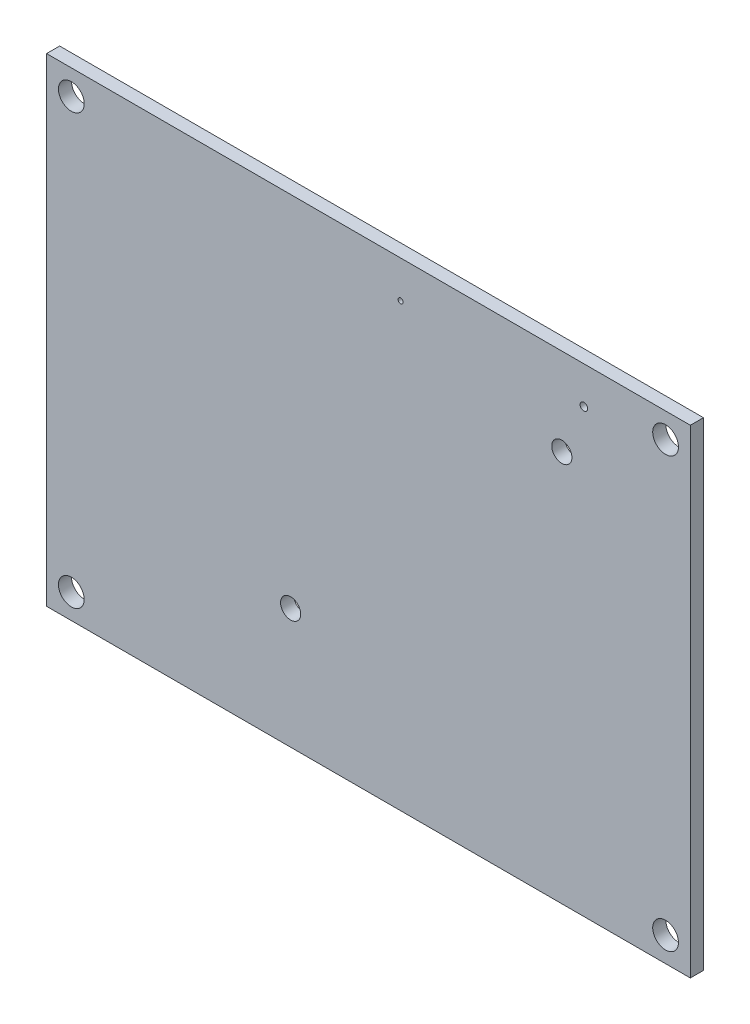
ISO-10303-21;
HEADER;
FILE_DESCRIPTION(('STEP AP214'),'2;1');
FILE_NAME('part.step','',(''),(''),'','','');
FILE_SCHEMA(('AUTOMOTIVE_DESIGN { 1 0 10303 214 1 1 1 1 }'));
ENDSEC;
DATA;
#1=APPLICATION_CONTEXT('core data for automotive mechanical design processes');
#2=APPLICATION_PROTOCOL_DEFINITION('international standard','automotive_design',2000,#1);
#3=PRODUCT_CONTEXT('',#1,'mechanical');
#4=PRODUCT('Part','Part','',(#3));
#5=PRODUCT_RELATED_PRODUCT_CATEGORY('part','',(#4));
#6=PRODUCT_DEFINITION_FORMATION('','',#4);
#7=PRODUCT_DEFINITION_CONTEXT('part definition',#1,'design');
#8=PRODUCT_DEFINITION('design','',#6,#7);
#9=PRODUCT_DEFINITION_SHAPE('','',#8);
#10=(LENGTH_UNIT() NAMED_UNIT(*) SI_UNIT(.MILLI.,.METRE.));
#11=(NAMED_UNIT(*) PLANE_ANGLE_UNIT() SI_UNIT($,.RADIAN.));
#12=(NAMED_UNIT(*) SI_UNIT($,.STERADIAN.) SOLID_ANGLE_UNIT());
#13=UNCERTAINTY_MEASURE_WITH_UNIT(LENGTH_MEASURE(1.E-05),#10,'distance_accuracy_value','');
#14=(GEOMETRIC_REPRESENTATION_CONTEXT(3) GLOBAL_UNCERTAINTY_ASSIGNED_CONTEXT((#13)) GLOBAL_UNIT_ASSIGNED_CONTEXT((#10,
#11,#12)) REPRESENTATION_CONTEXT('',''));
#15=CARTESIAN_POINT('',(0.,0.,0.));
#16=DIRECTION('',(0.,0.,1.));
#17=DIRECTION('',(1.,0.,0.));
#18=AXIS2_PLACEMENT_3D('',#15,#16,#17);
#19=CARTESIAN_POINT('',(49.53,36.83,-0.0001));
#20=DIRECTION('',(0.,0.,1.));
#21=DIRECTION('',(0.,-1.,0.));
#22=AXIS2_PLACEMENT_3D('',#19,#20,#21);
#23=PLANE('',#22);
#24=DIRECTION('',(0.,1.,0.));
#25=VECTOR('',#24,1.);
#26=CARTESIAN_POINT('',(0.,36.83,-0.0001));
#27=LINE('',#26,#25);
#28=CARTESIAN_POINT('',(0.,73.66,-0.0001));
#29=VERTEX_POINT('',#28);
#30=CARTESIAN_POINT('',(0.,0.,-0.0001));
#31=VERTEX_POINT('',#30);
#32=EDGE_CURVE('E60',#29,#31,#27,.F.);
#33=ORIENTED_EDGE('',*,*,#32,.F.);
#34=DIRECTION('',(1.,0.,0.));
#35=VECTOR('',#34,1.);
#36=CARTESIAN_POINT('',(49.53,73.66,-0.0001));
#37=LINE('',#36,#35);
#38=CARTESIAN_POINT('',(99.06,73.66,-0.0001));
#39=VERTEX_POINT('',#38);
#40=EDGE_CURVE('E307',#39,#29,#37,.F.);
#41=ORIENTED_EDGE('',*,*,#40,.F.);
#42=DIRECTION('',(0.,1.,0.));
#43=VECTOR('',#42,1.);
#44=CARTESIAN_POINT('',(99.06,36.83,-0.0001));
#45=LINE('',#44,#43);
#46=CARTESIAN_POINT('',(99.06,0.,-0.0001));
#47=VERTEX_POINT('',#46);
#48=EDGE_CURVE('E72',#47,#39,#45,.T.);
#49=ORIENTED_EDGE('',*,*,#48,.F.);
#50=DIRECTION('',(1.,0.,0.));
#51=VECTOR('',#50,1.);
#52=CARTESIAN_POINT('',(49.53,0.,-0.0001));
#53=LINE('',#52,#51);
#54=EDGE_CURVE('E55',#31,#47,#53,.T.);
#55=ORIENTED_EDGE('',*,*,#54,.F.);
#56=EDGE_LOOP('',(#33,#41,#49,#55));
#57=FACE_BOUND('',#56,.T.);
#58=CARTESIAN_POINT('',(54.48,67.945,-0.000100000000000057));
#59=DIRECTION('',(0.,0.,1.));
#60=DIRECTION('',(1.,0.,0.));
#61=AXIS2_PLACEMENT_3D('',#58,#59,#60);
#62=CIRCLE('',#61,0.39370000000001);
#63=CARTESIAN_POINT('',(54.8737,67.945,-0.000100000000000057));
#64=VERTEX_POINT('',#63);
#65=EDGE_CURVE('E69',#64,#64,#62,.T.);
#66=ORIENTED_EDGE('',*,*,#65,.T.);
#67=EDGE_LOOP('',(#66));
#68=FACE_BOUND('',#67,.T.);
#69=CARTESIAN_POINT('',(82.68,67.945,-0.000100000000000057));
#70=DIRECTION('',(0.,0.,1.));
#71=DIRECTION('',(1.,0.,0.));
#72=AXIS2_PLACEMENT_3D('',#69,#70,#71);
#73=CIRCLE('',#72,0.58420000000001);
#74=CARTESIAN_POINT('',(83.2642,67.945,-0.000100000000000057));
#75=VERTEX_POINT('',#74);
#76=EDGE_CURVE('E110',#75,#75,#73,.T.);
#77=ORIENTED_EDGE('',*,*,#76,.T.);
#78=EDGE_LOOP('',(#77));
#79=FACE_BOUND('',#78,.T.);
#80=CARTESIAN_POINT('',(79.2861,60.2361,-0.000100000000000057));
#81=DIRECTION('',(0.,0.,1.));
#82=DIRECTION('',(1.,0.,0.));
#83=AXIS2_PLACEMENT_3D('',#80,#81,#82);
#84=CIRCLE('',#83,1.5494);
#85=CARTESIAN_POINT('',(80.8355,60.2361,-0.000100000000000057));
#86=VERTEX_POINT('',#85);
#87=EDGE_CURVE('E113',#86,#86,#84,.T.);
#88=ORIENTED_EDGE('',*,*,#87,.T.);
#89=EDGE_LOOP('',(#88));
#90=FACE_BOUND('',#89,.T.);
#91=CARTESIAN_POINT('',(37.5539,18.5039,-0.000100000000000057));
#92=DIRECTION('',(0.,0.,1.));
#93=DIRECTION('',(1.,0.,0.));
#94=AXIS2_PLACEMENT_3D('',#91,#92,#93);
#95=CIRCLE('',#94,1.5494);
#96=CARTESIAN_POINT('',(39.1033,18.5039,-0.000100000000000057));
#97=VERTEX_POINT('',#96);
#98=EDGE_CURVE('E116',#97,#97,#95,.T.);
#99=ORIENTED_EDGE('',*,*,#98,.T.);
#100=EDGE_LOOP('',(#99));
#101=FACE_BOUND('',#100,.T.);
#102=CARTESIAN_POINT('',(3.81,3.81,-0.000100000000000057));
#103=DIRECTION('',(0.,0.,1.));
#104=DIRECTION('',(1.,0.,0.));
#105=AXIS2_PLACEMENT_3D('',#102,#103,#104);
#106=CIRCLE('',#105,1.9812);
#107=CARTESIAN_POINT('',(5.7912,3.81,-0.000100000000000057));
#108=VERTEX_POINT('',#107);
#109=EDGE_CURVE('E119',#108,#108,#106,.T.);
#110=ORIENTED_EDGE('',*,*,#109,.T.);
#111=EDGE_LOOP('',(#110));
#112=FACE_BOUND('',#111,.T.);
#113=CARTESIAN_POINT('',(3.81,69.85,-0.000100000000000057));
#114=DIRECTION('',(0.,0.,1.));
#115=DIRECTION('',(1.,0.,0.));
#116=AXIS2_PLACEMENT_3D('',#113,#114,#115);
#117=CIRCLE('',#116,1.9812);
#118=CARTESIAN_POINT('',(5.7912,69.85,-0.000100000000000057));
#119=VERTEX_POINT('',#118);
#120=EDGE_CURVE('E122',#119,#119,#117,.T.);
#121=ORIENTED_EDGE('',*,*,#120,.T.);
#122=EDGE_LOOP('',(#121));
#123=FACE_BOUND('',#122,.T.);
#124=CARTESIAN_POINT('',(95.25,3.81,-0.000100000000000057));
#125=DIRECTION('',(0.,0.,1.));
#126=DIRECTION('',(1.,0.,0.));
#127=AXIS2_PLACEMENT_3D('',#124,#125,#126);
#128=CIRCLE('',#127,1.9812);
#129=CARTESIAN_POINT('',(97.2312,3.81,-0.000100000000000057));
#130=VERTEX_POINT('',#129);
#131=EDGE_CURVE('E124',#130,#130,#128,.T.);
#132=ORIENTED_EDGE('',*,*,#131,.T.);
#133=EDGE_LOOP('',(#132));
#134=FACE_BOUND('',#133,.T.);
#135=CARTESIAN_POINT('',(95.25,69.85,-0.000100000000000057));
#136=DIRECTION('',(0.,0.,1.));
#137=DIRECTION('',(1.,0.,0.));
#138=AXIS2_PLACEMENT_3D('',#135,#136,#137);
#139=CIRCLE('',#138,1.9812);
#140=CARTESIAN_POINT('',(97.2312,69.85,-0.000100000000000057));
#141=VERTEX_POINT('',#140);
#142=EDGE_CURVE('E20',#141,#141,#139,.T.);
#143=ORIENTED_EDGE('',*,*,#142,.T.);
#144=EDGE_LOOP('',(#143));
#145=FACE_BOUND('',#144,.T.);
#146=ADVANCED_FACE('F17',(#57,#68,#79,#90,#101,#112,#123,#134,#145),#23,.F.);
#147=CARTESIAN_POINT('',(95.25,69.85,-1.0001));
#148=DIRECTION('',(0.,0.,1.));
#149=DIRECTION('',(1.,0.,0.));
#150=AXIS2_PLACEMENT_3D('',#147,#148,#149);
#151=CYLINDRICAL_SURFACE('',#150,1.9812);
#152=ORIENTED_EDGE('',*,*,#142,.F.);
#153=EDGE_LOOP('',(#152));
#154=FACE_BOUND('',#153,.T.);
#155=CARTESIAN_POINT('',(95.25,69.85,2.013354));
#156=DIRECTION('',(0.,0.,1.));
#157=DIRECTION('',(1.,0.,0.));
#158=AXIS2_PLACEMENT_3D('',#155,#156,#157);
#159=CIRCLE('',#158,1.9812);
#160=CARTESIAN_POINT('',(97.2312,69.85,2.013354));
#161=VERTEX_POINT('',#160);
#162=EDGE_CURVE('E105',#161,#161,#159,.F.);
#163=ORIENTED_EDGE('',*,*,#162,.F.);
#164=EDGE_LOOP('',(#163));
#165=FACE_BOUND('',#164,.T.);
#166=ADVANCED_FACE('F132',(#154,#165),#151,.F.);
#167=CARTESIAN_POINT('',(95.25,3.81,-1.0001));
#168=DIRECTION('',(0.,0.,1.));
#169=DIRECTION('',(1.,0.,0.));
#170=AXIS2_PLACEMENT_3D('',#167,#168,#169);
#171=CYLINDRICAL_SURFACE('',#170,1.9812);
#172=ORIENTED_EDGE('',*,*,#131,.F.);
#173=EDGE_LOOP('',(#172));
#174=FACE_BOUND('',#173,.T.);
#175=CARTESIAN_POINT('',(95.25,3.81,2.013354));
#176=DIRECTION('',(0.,0.,1.));
#177=DIRECTION('',(1.,0.,0.));
#178=AXIS2_PLACEMENT_3D('',#175,#176,#177);
#179=CIRCLE('',#178,1.9812);
#180=CARTESIAN_POINT('',(97.2312,3.81,2.013354));
#181=VERTEX_POINT('',#180);
#182=EDGE_CURVE('E102',#181,#181,#179,.F.);
#183=ORIENTED_EDGE('',*,*,#182,.F.);
#184=EDGE_LOOP('',(#183));
#185=FACE_BOUND('',#184,.T.);
#186=ADVANCED_FACE('F135',(#174,#185),#171,.F.);
#187=CARTESIAN_POINT('',(3.81,69.85,-1.0001));
#188=DIRECTION('',(0.,0.,1.));
#189=DIRECTION('',(1.,0.,0.));
#190=AXIS2_PLACEMENT_3D('',#187,#188,#189);
#191=CYLINDRICAL_SURFACE('',#190,1.9812);
#192=ORIENTED_EDGE('',*,*,#120,.F.);
#193=EDGE_LOOP('',(#192));
#194=FACE_BOUND('',#193,.T.);
#195=CARTESIAN_POINT('',(3.81,69.85,2.013354));
#196=DIRECTION('',(0.,0.,1.));
#197=DIRECTION('',(1.,0.,0.));
#198=AXIS2_PLACEMENT_3D('',#195,#196,#197);
#199=CIRCLE('',#198,1.9812);
#200=CARTESIAN_POINT('',(5.7912,69.85,2.013354));
#201=VERTEX_POINT('',#200);
#202=EDGE_CURVE('E99',#201,#201,#199,.F.);
#203=ORIENTED_EDGE('',*,*,#202,.F.);
#204=EDGE_LOOP('',(#203));
#205=FACE_BOUND('',#204,.T.);
#206=ADVANCED_FACE('F178',(#194,#205),#191,.F.);
#207=CARTESIAN_POINT('',(3.81,3.81,-1.0001));
#208=DIRECTION('',(0.,0.,1.));
#209=DIRECTION('',(1.,0.,0.));
#210=AXIS2_PLACEMENT_3D('',#207,#208,#209);
#211=CYLINDRICAL_SURFACE('',#210,1.9812);
#212=ORIENTED_EDGE('',*,*,#109,.F.);
#213=EDGE_LOOP('',(#212));
#214=FACE_BOUND('',#213,.T.);
#215=CARTESIAN_POINT('',(3.81,3.81,2.013354));
#216=DIRECTION('',(0.,0.,1.));
#217=DIRECTION('',(1.,0.,0.));
#218=AXIS2_PLACEMENT_3D('',#215,#216,#217);
#219=CIRCLE('',#218,1.9812);
#220=CARTESIAN_POINT('',(5.7912,3.81,2.013354));
#221=VERTEX_POINT('',#220);
#222=EDGE_CURVE('E96',#221,#221,#219,.F.);
#223=ORIENTED_EDGE('',*,*,#222,.F.);
#224=EDGE_LOOP('',(#223));
#225=FACE_BOUND('',#224,.T.);
#226=ADVANCED_FACE('F174',(#214,#225),#211,.F.);
#227=CARTESIAN_POINT('',(37.5539,18.5039,-1.0001));
#228=DIRECTION('',(0.,0.,1.));
#229=DIRECTION('',(1.,0.,0.));
#230=AXIS2_PLACEMENT_3D('',#227,#228,#229);
#231=CYLINDRICAL_SURFACE('',#230,1.5494);
#232=ORIENTED_EDGE('',*,*,#98,.F.);
#233=EDGE_LOOP('',(#232));
#234=FACE_BOUND('',#233,.T.);
#235=CARTESIAN_POINT('',(37.5539,18.5039,2.013354));
#236=DIRECTION('',(0.,0.,1.));
#237=DIRECTION('',(1.,0.,0.));
#238=AXIS2_PLACEMENT_3D('',#235,#236,#237);
#239=CIRCLE('',#238,1.5494);
#240=CARTESIAN_POINT('',(39.1033,18.5039,2.013354));
#241=VERTEX_POINT('',#240);
#242=EDGE_CURVE('E93',#241,#241,#239,.F.);
#243=ORIENTED_EDGE('',*,*,#242,.F.);
#244=EDGE_LOOP('',(#243));
#245=FACE_BOUND('',#244,.T.);
#246=ADVANCED_FACE('F170',(#234,#245),#231,.F.);
#247=CARTESIAN_POINT('',(79.2861,60.2361,-1.0001));
#248=DIRECTION('',(0.,0.,1.));
#249=DIRECTION('',(1.,0.,0.));
#250=AXIS2_PLACEMENT_3D('',#247,#248,#249);
#251=CYLINDRICAL_SURFACE('',#250,1.5494);
#252=ORIENTED_EDGE('',*,*,#87,.F.);
#253=EDGE_LOOP('',(#252));
#254=FACE_BOUND('',#253,.T.);
#255=CARTESIAN_POINT('',(79.2861,60.2361,2.013354));
#256=DIRECTION('',(0.,0.,1.));
#257=DIRECTION('',(1.,0.,0.));
#258=AXIS2_PLACEMENT_3D('',#255,#256,#257);
#259=CIRCLE('',#258,1.5494);
#260=CARTESIAN_POINT('',(80.8355,60.2361,2.013354));
#261=VERTEX_POINT('',#260);
#262=EDGE_CURVE('E90',#261,#261,#259,.F.);
#263=ORIENTED_EDGE('',*,*,#262,.F.);
#264=EDGE_LOOP('',(#263));
#265=FACE_BOUND('',#264,.T.);
#266=ADVANCED_FACE('F166',(#254,#265),#251,.F.);
#267=CARTESIAN_POINT('',(82.68,67.945,-1.0001));
#268=DIRECTION('',(0.,0.,1.));
#269=DIRECTION('',(1.,0.,0.));
#270=AXIS2_PLACEMENT_3D('',#267,#268,#269);
#271=CYLINDRICAL_SURFACE('',#270,0.58420000000001);
#272=ORIENTED_EDGE('',*,*,#76,.F.);
#273=EDGE_LOOP('',(#272));
#274=FACE_BOUND('',#273,.T.);
#275=CARTESIAN_POINT('',(82.68,67.945,2.013354));
#276=DIRECTION('',(0.,0.,1.));
#277=DIRECTION('',(1.,0.,0.));
#278=AXIS2_PLACEMENT_3D('',#275,#276,#277);
#279=CIRCLE('',#278,0.58420000000001);
#280=CARTESIAN_POINT('',(83.2642,67.945,2.013354));
#281=VERTEX_POINT('',#280);
#282=EDGE_CURVE('E87',#281,#281,#279,.F.);
#283=ORIENTED_EDGE('',*,*,#282,.F.);
#284=EDGE_LOOP('',(#283));
#285=FACE_BOUND('',#284,.T.);
#286=ADVANCED_FACE('F162',(#274,#285),#271,.F.);
#287=CARTESIAN_POINT('',(54.48,67.945,-1.0001));
#288=DIRECTION('',(0.,0.,1.));
#289=DIRECTION('',(1.,0.,0.));
#290=AXIS2_PLACEMENT_3D('',#287,#288,#289);
#291=CYLINDRICAL_SURFACE('',#290,0.39370000000001);
#292=ORIENTED_EDGE('',*,*,#65,.F.);
#293=EDGE_LOOP('',(#292));
#294=FACE_BOUND('',#293,.T.);
#295=CARTESIAN_POINT('',(54.48,67.945,2.013354));
#296=DIRECTION('',(0.,0.,1.));
#297=DIRECTION('',(1.,0.,0.));
#298=AXIS2_PLACEMENT_3D('',#295,#296,#297);
#299=CIRCLE('',#298,0.39370000000001);
#300=CARTESIAN_POINT('',(54.8737,67.945,2.013354));
#301=VERTEX_POINT('',#300);
#302=EDGE_CURVE('E83',#301,#301,#299,.F.);
#303=ORIENTED_EDGE('',*,*,#302,.F.);
#304=EDGE_LOOP('',(#303));
#305=FACE_BOUND('',#304,.T.);
#306=ADVANCED_FACE('F159',(#294,#305),#291,.F.);
#307=CARTESIAN_POINT('',(0.,36.83,-0.0001));
#308=DIRECTION('',(-1.,0.,0.));
#309=DIRECTION('',(0.,0.,1.));
#310=AXIS2_PLACEMENT_3D('',#307,#308,#309);
#311=PLANE('',#310);
#312=ORIENTED_EDGE('',*,*,#32,.T.);
#313=DIRECTION('',(0.,0.,-1.));
#314=VECTOR('',#313,1.);
#315=CARTESIAN_POINT('',(0.,0.,-0.0001));
#316=LINE('',#315,#314);
#317=CARTESIAN_POINT('',(0.,0.,2.013354));
#318=VERTEX_POINT('',#317);
#319=EDGE_CURVE('E62',#318,#31,#316,.T.);
#320=ORIENTED_EDGE('',*,*,#319,.F.);
#321=DIRECTION('',(0.,-1.,0.));
#322=VECTOR('',#321,1.);
#323=CARTESIAN_POINT('',(0.,36.83,2.013354));
#324=LINE('',#323,#322);
#325=CARTESIAN_POINT('',(0.,73.66,2.013354));
#326=VERTEX_POINT('',#325);
#327=EDGE_CURVE('E86',#326,#318,#324,.T.);
#328=ORIENTED_EDGE('',*,*,#327,.F.);
#329=DIRECTION('',(0.,0.,1.));
#330=VECTOR('',#329,1.);
#331=CARTESIAN_POINT('',(0.,73.66,-0.0001));
#332=LINE('',#331,#330);
#333=EDGE_CURVE('E65',#29,#326,#332,.T.);
#334=ORIENTED_EDGE('',*,*,#333,.F.);
#335=EDGE_LOOP('',(#312,#320,#328,#334));
#336=FACE_BOUND('',#335,.T.);
#337=ADVANCED_FACE('F61',(#336),#311,.T.);
#338=CARTESIAN_POINT('',(49.53,0.,-0.0001));
#339=DIRECTION('',(0.,-1.,0.));
#340=DIRECTION('',(0.,0.,-1.));
#341=AXIS2_PLACEMENT_3D('',#338,#339,#340);
#342=PLANE('',#341);
#343=ORIENTED_EDGE('',*,*,#54,.T.);
#344=DIRECTION('',(0.,0.,-1.));
#345=VECTOR('',#344,1.);
#346=CARTESIAN_POINT('',(99.06,0.,-0.0001));
#347=LINE('',#346,#345);
#348=CARTESIAN_POINT('',(99.06,0.,2.013354));
#349=VERTEX_POINT('',#348);
#350=EDGE_CURVE('E74',#349,#47,#347,.T.);
#351=ORIENTED_EDGE('',*,*,#350,.F.);
#352=DIRECTION('',(1.,0.,0.));
#353=VECTOR('',#352,1.);
#354=CARTESIAN_POINT('',(49.53,0.,2.013354));
#355=LINE('',#354,#353);
#356=EDGE_CURVE('E78',#318,#349,#355,.T.);
#357=ORIENTED_EDGE('',*,*,#356,.F.);
#358=ORIENTED_EDGE('',*,*,#319,.T.);
#359=EDGE_LOOP('',(#343,#351,#357,#358));
#360=FACE_BOUND('',#359,.T.);
#361=ADVANCED_FACE('F76',(#360),#342,.T.);
#362=CARTESIAN_POINT('',(99.06,36.83,-0.0001));
#363=DIRECTION('',(1.,0.,0.));
#364=DIRECTION('',(0.,0.,-1.));
#365=AXIS2_PLACEMENT_3D('',#362,#363,#364);
#366=PLANE('',#365);
#367=ORIENTED_EDGE('',*,*,#48,.T.);
#368=DIRECTION('',(0.,0.,1.));
#369=VECTOR('',#368,1.);
#370=CARTESIAN_POINT('',(99.06,73.66,-0.0001));
#371=LINE('',#370,#369);
#372=CARTESIAN_POINT('',(99.06,73.66,2.013354));
#373=VERTEX_POINT('',#372);
#374=EDGE_CURVE('E35',#373,#39,#371,.F.);
#375=ORIENTED_EDGE('',*,*,#374,.F.);
#376=DIRECTION('',(0.,-1.,0.));
#377=VECTOR('',#376,1.);
#378=CARTESIAN_POINT('',(99.06,36.83,2.013354));
#379=LINE('',#378,#377);
#380=EDGE_CURVE('E26',#349,#373,#379,.F.);
#381=ORIENTED_EDGE('',*,*,#380,.F.);
#382=ORIENTED_EDGE('',*,*,#350,.T.);
#383=EDGE_LOOP('',(#367,#375,#381,#382));
#384=FACE_BOUND('',#383,.T.);
#385=ADVANCED_FACE('F147',(#384),#366,.T.);
#386=CARTESIAN_POINT('',(49.53,73.66,-0.0001));
#387=DIRECTION('',(0.,1.,0.));
#388=DIRECTION('',(0.,0.,1.));
#389=AXIS2_PLACEMENT_3D('',#386,#387,#388);
#390=PLANE('',#389);
#391=ORIENTED_EDGE('',*,*,#40,.T.);
#392=ORIENTED_EDGE('',*,*,#333,.T.);
#393=DIRECTION('',(1.,0.,0.));
#394=VECTOR('',#393,1.);
#395=CARTESIAN_POINT('',(49.53,73.66,2.013354));
#396=LINE('',#395,#394);
#397=EDGE_CURVE('E11',#373,#326,#396,.F.);
#398=ORIENTED_EDGE('',*,*,#397,.F.);
#399=ORIENTED_EDGE('',*,*,#374,.T.);
#400=EDGE_LOOP('',(#391,#392,#398,#399));
#401=FACE_BOUND('',#400,.T.);
#402=ADVANCED_FACE('F140',(#401),#390,.T.);
#403=CARTESIAN_POINT('',(49.53,36.83,2.013354));
#404=DIRECTION('',(0.,0.,1.));
#405=DIRECTION('',(0.,-1.,0.));
#406=AXIS2_PLACEMENT_3D('',#403,#404,#405);
#407=PLANE('',#406);
#408=ORIENTED_EDGE('',*,*,#380,.T.);
#409=ORIENTED_EDGE('',*,*,#397,.T.);
#410=ORIENTED_EDGE('',*,*,#327,.T.);
#411=ORIENTED_EDGE('',*,*,#356,.T.);
#412=EDGE_LOOP('',(#408,#409,#410,#411));
#413=FACE_BOUND('',#412,.T.);
#414=ORIENTED_EDGE('',*,*,#302,.T.);
#415=EDGE_LOOP('',(#414));
#416=FACE_BOUND('',#415,.T.);
#417=ORIENTED_EDGE('',*,*,#282,.T.);
#418=EDGE_LOOP('',(#417));
#419=FACE_BOUND('',#418,.T.);
#420=ORIENTED_EDGE('',*,*,#262,.T.);
#421=EDGE_LOOP('',(#420));
#422=FACE_BOUND('',#421,.T.);
#423=ORIENTED_EDGE('',*,*,#242,.T.);
#424=EDGE_LOOP('',(#423));
#425=FACE_BOUND('',#424,.T.);
#426=ORIENTED_EDGE('',*,*,#222,.T.);
#427=EDGE_LOOP('',(#426));
#428=FACE_BOUND('',#427,.T.);
#429=ORIENTED_EDGE('',*,*,#202,.T.);
#430=EDGE_LOOP('',(#429));
#431=FACE_BOUND('',#430,.T.);
#432=ORIENTED_EDGE('',*,*,#182,.T.);
#433=EDGE_LOOP('',(#432));
#434=FACE_BOUND('',#433,.T.);
#435=ORIENTED_EDGE('',*,*,#162,.T.);
#436=EDGE_LOOP('',(#435));
#437=FACE_BOUND('',#436,.T.);
#438=ADVANCED_FACE('F138',(#413,#416,#419,#422,#425,#428,#431,#434,#437),#407,.T.);
#439=CLOSED_SHELL('',(#146,#166,#186,#206,#226,#246,#266,#286,#306,#337,#361,#385,#402,#438));
#440=MANIFOLD_SOLID_BREP('B1',#439);
#441=ADVANCED_BREP_SHAPE_REPRESENTATION('',(#18,#440),#14);
#442=SHAPE_DEFINITION_REPRESENTATION(#9,#441);
ENDSEC;
END-ISO-10303-21;
